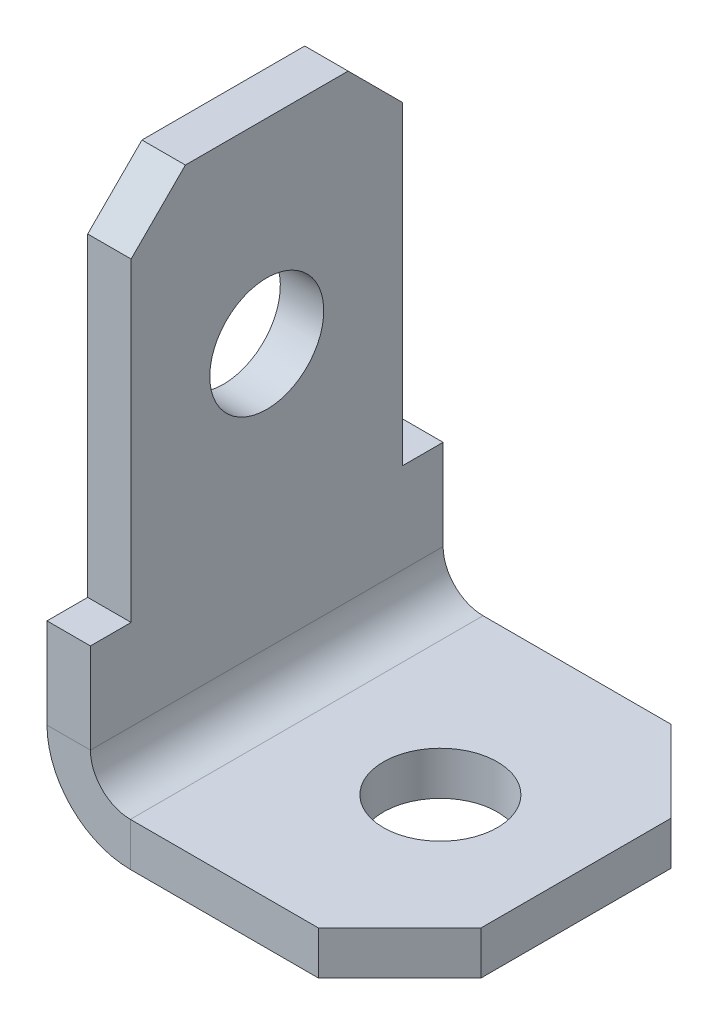
ISO-10303-21;
HEADER;
FILE_DESCRIPTION(('STEP AP214'),'2;1');
FILE_NAME('part.step','',(''),(''),'','','');
FILE_SCHEMA(('AUTOMOTIVE_DESIGN { 1 0 10303 214 1 1 1 1 }'));
ENDSEC;
DATA;
#1=APPLICATION_CONTEXT('core data for automotive mechanical design processes');
#2=APPLICATION_PROTOCOL_DEFINITION('international standard','automotive_design',2000,#1);
#3=PRODUCT_CONTEXT('',#1,'mechanical');
#4=PRODUCT('Part','Part','',(#3));
#5=PRODUCT_RELATED_PRODUCT_CATEGORY('part','',(#4));
#6=PRODUCT_DEFINITION_FORMATION('','',#4);
#7=PRODUCT_DEFINITION_CONTEXT('part definition',#1,'design');
#8=PRODUCT_DEFINITION('design','',#6,#7);
#9=PRODUCT_DEFINITION_SHAPE('','',#8);
#10=(LENGTH_UNIT() NAMED_UNIT(*) SI_UNIT(.MILLI.,.METRE.));
#11=(NAMED_UNIT(*) PLANE_ANGLE_UNIT() SI_UNIT($,.RADIAN.));
#12=(NAMED_UNIT(*) SI_UNIT($,.STERADIAN.) SOLID_ANGLE_UNIT());
#13=UNCERTAINTY_MEASURE_WITH_UNIT(LENGTH_MEASURE(1.E-05),#10,'distance_accuracy_value','');
#14=(GEOMETRIC_REPRESENTATION_CONTEXT(3) GLOBAL_UNCERTAINTY_ASSIGNED_CONTEXT((#13)) GLOBAL_UNIT_ASSIGNED_CONTEXT((#10,
#11,#12)) REPRESENTATION_CONTEXT('',''));
#15=CARTESIAN_POINT('',(0.,0.,0.));
#16=DIRECTION('',(0.,0.,1.));
#17=DIRECTION('',(1.,0.,0.));
#18=AXIS2_PLACEMENT_3D('',#15,#16,#17);
#19=CARTESIAN_POINT('',(-3.25000000000003,9.2,3.25));
#20=DIRECTION('',(0.,0.,-1.));
#21=DIRECTION('',(-1.,0.,0.));
#22=AXIS2_PLACEMENT_3D('',#19,#20,#21);
#23=PLANE('',#22);
#24=DIRECTION('',(-1.,0.,0.));
#25=VECTOR('',#24,1.);
#26=CARTESIAN_POINT('',(3.25000000000002,2.40000000000002,3.25));
#27=LINE('',#26,#25);
#28=CARTESIAN_POINT('',(-2.45000000000001,2.4,3.25));
#29=VERTEX_POINT('',#28);
#30=CARTESIAN_POINT('',(-3.25000000000001,2.4,3.25));
#31=VERTEX_POINT('',#30);
#32=EDGE_CURVE('E330',#29,#31,#27,.T.);
#33=ORIENTED_EDGE('',*,*,#32,.T.);
#34=DIRECTION('',(0.,1.,0.));
#35=VECTOR('',#34,1.);
#36=CARTESIAN_POINT('',(-3.25,0.,3.25));
#37=LINE('',#36,#35);
#38=CARTESIAN_POINT('',(-3.25,0.736599999999995,3.25));
#39=VERTEX_POINT('',#38);
#40=EDGE_CURVE('E202',#39,#31,#37,.T.);
#41=ORIENTED_EDGE('',*,*,#40,.F.);
#42=DIRECTION('',(1.,0.,0.));
#43=VECTOR('',#42,1.);
#44=CARTESIAN_POINT('',(-2.45,0.736599999999997,3.25));
#45=LINE('',#44,#43);
#46=CARTESIAN_POINT('',(-2.45,0.736599999999997,3.25));
#47=VERTEX_POINT('',#46);
#48=EDGE_CURVE('E219',#47,#39,#45,.F.);
#49=ORIENTED_EDGE('',*,*,#48,.F.);
#50=DIRECTION('',(0.,-1.,0.));
#51=VECTOR('',#50,1.);
#52=CARTESIAN_POINT('',(-2.45000000000003,9.2,3.25));
#53=LINE('',#52,#51);
#54=EDGE_CURVE('E214',#47,#29,#53,.F.);
#55=ORIENTED_EDGE('',*,*,#54,.T.);
#56=EDGE_LOOP('',(#33,#41,#49,#55));
#57=FACE_BOUND('',#56,.T.);
#58=ADVANCED_FACE('F58',(#57),#23,.F.);
#59=CARTESIAN_POINT('',(-3.25,0.,0.));
#60=DIRECTION('',(1.,0.,0.));
#61=DIRECTION('',(0.,1.,0.));
#62=AXIS2_PLACEMENT_3D('',#59,#60,#61);
#63=PLANE('',#62);
#64=CARTESIAN_POINT('',(-3.25000000000002,5.6,0.));
#65=DIRECTION('',(-1.,0.,0.));
#66=DIRECTION('',(0.,-1.,0.));
#67=AXIS2_PLACEMENT_3D('',#64,#65,#66);
#68=CIRCLE('',#67,1.05);
#69=CARTESIAN_POINT('',(-3.25000000000002,4.55,0.));
#70=VERTEX_POINT('',#69);
#71=EDGE_CURVE('E333',#70,#70,#68,.T.);
#72=ORIENTED_EDGE('',*,*,#71,.F.);
#73=EDGE_LOOP('',(#72));
#74=FACE_BOUND('',#73,.T.);
#75=DIRECTION('',(0.,-1.,0.));
#76=VECTOR('',#75,1.);
#77=CARTESIAN_POINT('',(-3.25,0.,2.5));
#78=LINE('',#77,#76);
#79=CARTESIAN_POINT('',(-3.25000000000003,8.19999999999999,2.5));
#80=VERTEX_POINT('',#79);
#81=CARTESIAN_POINT('',(-3.25000000000001,2.4,2.5));
#82=VERTEX_POINT('',#81);
#83=EDGE_CURVE('E317',#80,#82,#78,.T.);
#84=ORIENTED_EDGE('',*,*,#83,.F.);
#85=DIRECTION('',(0.,-0.707106781186548,0.707106781186547));
#86=VECTOR('',#85,1.);
#87=CARTESIAN_POINT('',(-3.25000000000003,9.2,1.49999999999999));
#88=LINE('',#87,#86);
#89=CARTESIAN_POINT('',(-3.25000000000003,9.2,1.49999999999999));
#90=VERTEX_POINT('',#89);
#91=EDGE_CURVE('E13',#80,#90,#88,.F.);
#92=ORIENTED_EDGE('',*,*,#91,.T.);
#93=DIRECTION('',(0.,0.,-1.));
#94=VECTOR('',#93,1.);
#95=CARTESIAN_POINT('',(-3.25000000000003,9.2,0.));
#96=LINE('',#95,#94);
#97=CARTESIAN_POINT('',(-3.25000000000003,9.2,-1.49999999999999));
#98=VERTEX_POINT('',#97);
#99=EDGE_CURVE('E197',#90,#98,#96,.T.);
#100=ORIENTED_EDGE('',*,*,#99,.T.);
#101=DIRECTION('',(0.,-0.707106781186548,-0.707106781186547));
#102=VECTOR('',#101,1.);
#103=CARTESIAN_POINT('',(-3.25000000000003,8.19999999999999,-2.5));
#104=LINE('',#103,#102);
#105=CARTESIAN_POINT('',(-3.25000000000003,8.19999999999999,-2.5));
#106=VERTEX_POINT('',#105);
#107=EDGE_CURVE('E297',#98,#106,#104,.T.);
#108=ORIENTED_EDGE('',*,*,#107,.T.);
#109=DIRECTION('',(0.,-1.,0.));
#110=VECTOR('',#109,1.);
#111=CARTESIAN_POINT('',(-3.25,0.,-2.5));
#112=LINE('',#111,#110);
#113=CARTESIAN_POINT('',(-3.25000000000001,2.4,-2.5));
#114=VERTEX_POINT('',#113);
#115=EDGE_CURVE('E189',#106,#114,#112,.T.);
#116=ORIENTED_EDGE('',*,*,#115,.T.);
#117=DIRECTION('',(0.,0.,1.));
#118=VECTOR('',#117,1.);
#119=CARTESIAN_POINT('',(-3.25000000000001,2.4,0.));
#120=LINE('',#119,#118);
#121=CARTESIAN_POINT('',(-3.25000000000001,2.4,-3.25));
#122=VERTEX_POINT('',#121);
#123=EDGE_CURVE('E175',#122,#114,#120,.T.);
#124=ORIENTED_EDGE('',*,*,#123,.F.);
#125=DIRECTION('',(0.,-1.,0.));
#126=VECTOR('',#125,1.);
#127=CARTESIAN_POINT('',(-3.25,0.,-3.25));
#128=LINE('',#127,#126);
#129=CARTESIAN_POINT('',(-3.25,0.736599999999995,-3.25));
#130=VERTEX_POINT('',#129);
#131=EDGE_CURVE('E186',#122,#130,#128,.T.);
#132=ORIENTED_EDGE('',*,*,#131,.T.);
#133=DIRECTION('',(0.,0.,1.));
#134=VECTOR('',#133,1.);
#135=CARTESIAN_POINT('',(-3.25,0.736599999999995,-3.25));
#136=LINE('',#135,#134);
#137=EDGE_CURVE('E217',#39,#130,#136,.F.);
#138=ORIENTED_EDGE('',*,*,#137,.F.);
#139=ORIENTED_EDGE('',*,*,#40,.T.);
#140=DIRECTION('',(0.,0.,-1.));
#141=VECTOR('',#140,1.);
#142=CARTESIAN_POINT('',(-3.25000000000001,2.4,0.));
#143=LINE('',#142,#141);
#144=EDGE_CURVE('E319',#31,#82,#143,.T.);
#145=ORIENTED_EDGE('',*,*,#144,.T.);
#146=EDGE_LOOP('',(#84,#92,#100,#108,#116,#124,#132,#138,#139,#145));
#147=FACE_BOUND('',#146,.T.);
#148=ADVANCED_FACE('F184',(#74,#147),#63,.F.);
#149=CARTESIAN_POINT('',(-2.45,0.,0.));
#150=DIRECTION('',(1.,0.,0.));
#151=DIRECTION('',(0.,1.,0.));
#152=AXIS2_PLACEMENT_3D('',#149,#150,#151);
#153=PLANE('',#152);
#154=CARTESIAN_POINT('',(-2.45000000000002,5.6,0.));
#155=DIRECTION('',(1.,0.,0.));
#156=DIRECTION('',(0.,1.,0.));
#157=AXIS2_PLACEMENT_3D('',#154,#155,#156);
#158=CIRCLE('',#157,1.05);
#159=CARTESIAN_POINT('',(-2.45000000000002,4.55,0.));
#160=VERTEX_POINT('',#159);
#161=EDGE_CURVE('E225',#160,#160,#158,.T.);
#162=ORIENTED_EDGE('',*,*,#161,.F.);
#163=EDGE_LOOP('',(#162));
#164=FACE_BOUND('',#163,.T.);
#165=DIRECTION('',(0.,0.,1.));
#166=VECTOR('',#165,1.);
#167=CARTESIAN_POINT('',(-2.45000000000003,9.2,-3.25));
#168=LINE('',#167,#166);
#169=CARTESIAN_POINT('',(-2.45000000000003,9.2,1.49999999999999));
#170=VERTEX_POINT('',#169);
#171=CARTESIAN_POINT('',(-2.45000000000003,9.2,-1.49999999999999));
#172=VERTEX_POINT('',#171);
#173=EDGE_CURVE('E212',#170,#172,#168,.F.);
#174=ORIENTED_EDGE('',*,*,#173,.F.);
#175=DIRECTION('',(0.,0.707106781186548,-0.707106781186547));
#176=VECTOR('',#175,1.);
#177=CARTESIAN_POINT('',(-2.45000000000002,5.34999999999998,5.35000000000001));
#178=LINE('',#177,#176);
#179=CARTESIAN_POINT('',(-2.45000000000003,8.2,2.5));
#180=VERTEX_POINT('',#179);
#181=EDGE_CURVE('E81',#170,#180,#178,.F.);
#182=ORIENTED_EDGE('',*,*,#181,.T.);
#183=DIRECTION('',(0.,1.,0.));
#184=VECTOR('',#183,1.);
#185=CARTESIAN_POINT('',(-2.45,0.,2.5));
#186=LINE('',#185,#184);
#187=CARTESIAN_POINT('',(-2.45000000000002,2.4,2.5));
#188=VERTEX_POINT('',#187);
#189=EDGE_CURVE('E325',#188,#180,#186,.T.);
#190=ORIENTED_EDGE('',*,*,#189,.F.);
#191=DIRECTION('',(0.,0.,1.));
#192=VECTOR('',#191,1.);
#193=CARTESIAN_POINT('',(-2.45000000000001,2.4,0.));
#194=LINE('',#193,#192);
#195=EDGE_CURVE('E276',#188,#29,#194,.T.);
#196=ORIENTED_EDGE('',*,*,#195,.T.);
#197=ORIENTED_EDGE('',*,*,#54,.F.);
#198=DIRECTION('',(0.,0.,1.));
#199=VECTOR('',#198,1.);
#200=CARTESIAN_POINT('',(-2.45,0.736599999999997,-3.25));
#201=LINE('',#200,#199);
#202=CARTESIAN_POINT('',(-2.45,0.736599999999997,-3.25));
#203=VERTEX_POINT('',#202);
#204=EDGE_CURVE('E222',#203,#47,#201,.T.);
#205=ORIENTED_EDGE('',*,*,#204,.F.);
#206=DIRECTION('',(0.,1.,0.));
#207=VECTOR('',#206,1.);
#208=CARTESIAN_POINT('',(-2.45,0.,-3.25));
#209=LINE('',#208,#207);
#210=CARTESIAN_POINT('',(-2.45000000000002,2.4,-3.25));
#211=VERTEX_POINT('',#210);
#212=EDGE_CURVE('E210',#211,#203,#209,.F.);
#213=ORIENTED_EDGE('',*,*,#212,.F.);
#214=DIRECTION('',(0.,0.,-1.));
#215=VECTOR('',#214,1.);
#216=CARTESIAN_POINT('',(-2.45000000000001,2.4,0.));
#217=LINE('',#216,#215);
#218=CARTESIAN_POINT('',(-2.45000000000001,2.4,-2.5));
#219=VERTEX_POINT('',#218);
#220=EDGE_CURVE('E177',#219,#211,#217,.T.);
#221=ORIENTED_EDGE('',*,*,#220,.F.);
#222=DIRECTION('',(0.,1.,0.));
#223=VECTOR('',#222,1.);
#224=CARTESIAN_POINT('',(-2.45,0.,-2.5));
#225=LINE('',#224,#223);
#226=CARTESIAN_POINT('',(-2.45000000000003,8.2,-2.5));
#227=VERTEX_POINT('',#226);
#228=EDGE_CURVE('E205',#219,#227,#225,.T.);
#229=ORIENTED_EDGE('',*,*,#228,.T.);
#230=DIRECTION('',(0.,0.707106781186548,0.707106781186547));
#231=VECTOR('',#230,1.);
#232=CARTESIAN_POINT('',(-2.45000000000002,5.34999999999998,-5.35000000000001));
#233=LINE('',#232,#231);
#234=EDGE_CURVE('E291',#227,#172,#233,.T.);
#235=ORIENTED_EDGE('',*,*,#234,.T.);
#236=EDGE_LOOP('',(#174,#182,#190,#196,#197,#205,#213,#221,#229,#235));
#237=FACE_BOUND('',#236,.T.);
#238=ADVANCED_FACE('F308',(#164,#237),#153,.T.);
#239=CARTESIAN_POINT('',(-3.25000000000003,9.2,-3.25));
#240=DIRECTION('',(0.,-1.,0.));
#241=DIRECTION('',(1.,0.,0.));
#242=AXIS2_PLACEMENT_3D('',#239,#240,#241);
#243=PLANE('',#242);
#244=ORIENTED_EDGE('',*,*,#99,.F.);
#245=DIRECTION('',(1.,0.,0.));
#246=VECTOR('',#245,1.);
#247=CARTESIAN_POINT('',(-3.25000000000003,9.2,1.49999999999999));
#248=LINE('',#247,#246);
#249=EDGE_CURVE('E299',#90,#170,#248,.T.);
#250=ORIENTED_EDGE('',*,*,#249,.T.);
#251=ORIENTED_EDGE('',*,*,#173,.T.);
#252=DIRECTION('',(-1.,0.,0.));
#253=VECTOR('',#252,1.);
#254=CARTESIAN_POINT('',(-3.25000000000003,9.2,-1.49999999999999));
#255=LINE('',#254,#253);
#256=EDGE_CURVE('E294',#172,#98,#255,.T.);
#257=ORIENTED_EDGE('',*,*,#256,.T.);
#258=EDGE_LOOP('',(#244,#250,#251,#257));
#259=FACE_BOUND('',#258,.T.);
#260=ADVANCED_FACE('F305',(#259),#243,.F.);
#261=CARTESIAN_POINT('',(-3.25,-0.8,3.25));
#262=DIRECTION('',(0.,0.,1.));
#263=DIRECTION('',(1.,0.,0.));
#264=AXIS2_PLACEMENT_3D('',#261,#262,#263);
#265=PLANE('',#264);
#266=DIRECTION('',(1.,0.,0.));
#267=VECTOR('',#266,1.);
#268=CARTESIAN_POINT('',(-3.25,0.,3.25));
#269=LINE('',#268,#267);
#270=CARTESIAN_POINT('',(-1.7134,0.,3.25));
#271=VERTEX_POINT('',#270);
#272=CARTESIAN_POINT('',(1.75,0.,3.25));
#273=VERTEX_POINT('',#272);
#274=EDGE_CURVE('E243',#271,#273,#269,.T.);
#275=ORIENTED_EDGE('',*,*,#274,.F.);
#276=DIRECTION('',(0.,-1.,0.));
#277=VECTOR('',#276,1.);
#278=CARTESIAN_POINT('',(-1.7134,0.,3.25));
#279=LINE('',#278,#277);
#280=CARTESIAN_POINT('',(-1.7134,-0.8,3.25));
#281=VERTEX_POINT('',#280);
#282=EDGE_CURVE('E233',#271,#281,#279,.T.);
#283=ORIENTED_EDGE('',*,*,#282,.T.);
#284=DIRECTION('',(1.,0.,0.));
#285=VECTOR('',#284,1.);
#286=CARTESIAN_POINT('',(-3.25,-0.8,3.25));
#287=LINE('',#286,#285);
#288=CARTESIAN_POINT('',(1.75,-0.8,3.25));
#289=VERTEX_POINT('',#288);
#290=EDGE_CURVE('E246',#281,#289,#287,.T.);
#291=ORIENTED_EDGE('',*,*,#290,.T.);
#292=DIRECTION('',(0.,1.,0.));
#293=VECTOR('',#292,1.);
#294=CARTESIAN_POINT('',(1.75,-0.8,3.25));
#295=LINE('',#294,#293);
#296=EDGE_CURVE('E261',#289,#273,#295,.T.);
#297=ORIENTED_EDGE('',*,*,#296,.T.);
#298=EDGE_LOOP('',(#275,#283,#291,#297));
#299=FACE_BOUND('',#298,.T.);
#300=ADVANCED_FACE('F378',(#299),#265,.T.);
#301=CARTESIAN_POINT('',(0.,-0.8,0.));
#302=DIRECTION('',(0.,-1.,0.));
#303=DIRECTION('',(0.,0.,-1.));
#304=AXIS2_PLACEMENT_3D('',#301,#302,#303);
#305=PLANE('',#304);
#306=CARTESIAN_POINT('',(0.749999999999999,-0.8,0.));
#307=DIRECTION('',(0.,1.,0.));
#308=DIRECTION('',(0.,0.,1.));
#309=AXIS2_PLACEMENT_3D('',#306,#307,#308);
#310=CIRCLE('',#309,1.05);
#311=CARTESIAN_POINT('',(0.749999999999999,-0.8,1.05));
#312=VERTEX_POINT('',#311);
#313=EDGE_CURVE('E337',#312,#312,#310,.T.);
#314=ORIENTED_EDGE('',*,*,#313,.T.);
#315=EDGE_LOOP('',(#314));
#316=FACE_BOUND('',#315,.T.);
#317=ORIENTED_EDGE('',*,*,#290,.F.);
#318=DIRECTION('',(0.,0.,1.));
#319=VECTOR('',#318,1.);
#320=CARTESIAN_POINT('',(-1.7134,-0.8,3.25));
#321=LINE('',#320,#319);
#322=CARTESIAN_POINT('',(-1.7134,-0.8,-3.25));
#323=VERTEX_POINT('',#322);
#324=EDGE_CURVE('E226',#281,#323,#321,.F.);
#325=ORIENTED_EDGE('',*,*,#324,.T.);
#326=DIRECTION('',(-1.,0.,0.));
#327=VECTOR('',#326,1.);
#328=CARTESIAN_POINT('',(-3.25,-0.8,-3.25));
#329=LINE('',#328,#327);
#330=CARTESIAN_POINT('',(1.75,-0.8,-3.25));
#331=VERTEX_POINT('',#330);
#332=EDGE_CURVE('E258',#331,#323,#329,.T.);
#333=ORIENTED_EDGE('',*,*,#332,.F.);
#334=DIRECTION('',(-0.707106781186547,0.,-0.707106781186547));
#335=VECTOR('',#334,1.);
#336=CARTESIAN_POINT('',(1.75,-0.8,-3.25));
#337=LINE('',#336,#335);
#338=CARTESIAN_POINT('',(3.25,-0.8,-1.75));
#339=VERTEX_POINT('',#338);
#340=EDGE_CURVE('E255',#339,#331,#337,.T.);
#341=ORIENTED_EDGE('',*,*,#340,.F.);
#342=DIRECTION('',(0.,0.,-1.));
#343=VECTOR('',#342,1.);
#344=CARTESIAN_POINT('',(3.25,-0.8,1.75));
#345=LINE('',#344,#343);
#346=CARTESIAN_POINT('',(3.25,-0.8,1.75));
#347=VERTEX_POINT('',#346);
#348=EDGE_CURVE('E252',#347,#339,#345,.T.);
#349=ORIENTED_EDGE('',*,*,#348,.F.);
#350=DIRECTION('',(0.707106781186547,0.,-0.707106781186548));
#351=VECTOR('',#350,1.);
#352=CARTESIAN_POINT('',(1.75,-0.8,3.25));
#353=LINE('',#352,#351);
#354=EDGE_CURVE('E248',#289,#347,#353,.T.);
#355=ORIENTED_EDGE('',*,*,#354,.F.);
#356=EDGE_LOOP('',(#317,#325,#333,#341,#349,#355));
#357=FACE_BOUND('',#356,.T.);
#358=ADVANCED_FACE('F361',(#316,#357),#305,.T.);
#359=CARTESIAN_POINT('',(0.,0.,0.));
#360=DIRECTION('',(0.,-1.,0.));
#361=DIRECTION('',(0.,0.,-1.));
#362=AXIS2_PLACEMENT_3D('',#359,#360,#361);
#363=PLANE('',#362);
#364=CARTESIAN_POINT('',(0.749999999999999,0.,0.));
#365=DIRECTION('',(0.,1.,0.));
#366=DIRECTION('',(0.,0.,1.));
#367=AXIS2_PLACEMENT_3D('',#364,#365,#366);
#368=CIRCLE('',#367,1.05);
#369=CARTESIAN_POINT('',(0.749999999999999,0.,1.05));
#370=VERTEX_POINT('',#369);
#371=EDGE_CURVE('E322',#370,#370,#368,.T.);
#372=ORIENTED_EDGE('',*,*,#371,.F.);
#373=EDGE_LOOP('',(#372));
#374=FACE_BOUND('',#373,.T.);
#375=DIRECTION('',(0.,0.,1.));
#376=VECTOR('',#375,1.);
#377=CARTESIAN_POINT('',(-1.7134,0.,3.25));
#378=LINE('',#377,#376);
#379=CARTESIAN_POINT('',(-1.7134,0.,-3.25));
#380=VERTEX_POINT('',#379);
#381=EDGE_CURVE('E200',#271,#380,#378,.F.);
#382=ORIENTED_EDGE('',*,*,#381,.F.);
#383=ORIENTED_EDGE('',*,*,#274,.T.);
#384=DIRECTION('',(0.707106781186547,0.,-0.707106781186548));
#385=VECTOR('',#384,1.);
#386=CARTESIAN_POINT('',(1.75,0.,3.25));
#387=LINE('',#386,#385);
#388=CARTESIAN_POINT('',(3.25,0.,1.75));
#389=VERTEX_POINT('',#388);
#390=EDGE_CURVE('E263',#273,#389,#387,.T.);
#391=ORIENTED_EDGE('',*,*,#390,.T.);
#392=DIRECTION('',(0.,0.,-1.));
#393=VECTOR('',#392,1.);
#394=CARTESIAN_POINT('',(3.25,0.,1.75));
#395=LINE('',#394,#393);
#396=CARTESIAN_POINT('',(3.25,0.,-1.75));
#397=VERTEX_POINT('',#396);
#398=EDGE_CURVE('E266',#389,#397,#395,.T.);
#399=ORIENTED_EDGE('',*,*,#398,.T.);
#400=DIRECTION('',(-0.707106781186547,0.,-0.707106781186547));
#401=VECTOR('',#400,1.);
#402=CARTESIAN_POINT('',(1.75,0.,-3.25));
#403=LINE('',#402,#401);
#404=CARTESIAN_POINT('',(1.75,0.,-3.25));
#405=VERTEX_POINT('',#404);
#406=EDGE_CURVE('E269',#397,#405,#403,.T.);
#407=ORIENTED_EDGE('',*,*,#406,.T.);
#408=DIRECTION('',(-1.,0.,0.));
#409=VECTOR('',#408,1.);
#410=CARTESIAN_POINT('',(-3.25,0.,-3.25));
#411=LINE('',#410,#409);
#412=EDGE_CURVE('E249',#405,#380,#411,.T.);
#413=ORIENTED_EDGE('',*,*,#412,.T.);
#414=EDGE_LOOP('',(#382,#383,#391,#399,#407,#413));
#415=FACE_BOUND('',#414,.T.);
#416=ADVANCED_FACE('F383',(#374,#415),#363,.F.);
#417=CARTESIAN_POINT('',(-3.25,-0.8,-3.25));
#418=DIRECTION('',(0.,0.,-1.));
#419=DIRECTION('',(-1.,0.,0.));
#420=AXIS2_PLACEMENT_3D('',#417,#418,#419);
#421=PLANE('',#420);
#422=DIRECTION('',(0.,-1.,0.));
#423=VECTOR('',#422,1.);
#424=CARTESIAN_POINT('',(-1.7134,0.,-3.25));
#425=LINE('',#424,#423);
#426=EDGE_CURVE('E240',#380,#323,#425,.T.);
#427=ORIENTED_EDGE('',*,*,#426,.F.);
#428=ORIENTED_EDGE('',*,*,#412,.F.);
#429=DIRECTION('',(0.,1.,0.));
#430=VECTOR('',#429,1.);
#431=CARTESIAN_POINT('',(1.75,-0.8,-3.25));
#432=LINE('',#431,#430);
#433=EDGE_CURVE('E274',#331,#405,#432,.T.);
#434=ORIENTED_EDGE('',*,*,#433,.F.);
#435=ORIENTED_EDGE('',*,*,#332,.T.);
#436=EDGE_LOOP('',(#427,#428,#434,#435));
#437=FACE_BOUND('',#436,.T.);
#438=ADVANCED_FACE('F364',(#437),#421,.T.);
#439=CARTESIAN_POINT('',(1.75,-0.8,-3.25));
#440=DIRECTION('',(0.707106781186548,0.,-0.707106781186548));
#441=DIRECTION('',(-0.707106781186548,0.,-0.707106781186548));
#442=AXIS2_PLACEMENT_3D('',#439,#440,#441);
#443=PLANE('',#442);
#444=ORIENTED_EDGE('',*,*,#406,.F.);
#445=DIRECTION('',(0.,1.,0.));
#446=VECTOR('',#445,1.);
#447=CARTESIAN_POINT('',(3.25,-0.8,-1.75));
#448=LINE('',#447,#446);
#449=EDGE_CURVE('E277',#339,#397,#448,.T.);
#450=ORIENTED_EDGE('',*,*,#449,.F.);
#451=ORIENTED_EDGE('',*,*,#340,.T.);
#452=ORIENTED_EDGE('',*,*,#433,.T.);
#453=EDGE_LOOP('',(#444,#450,#451,#452));
#454=FACE_BOUND('',#453,.T.);
#455=ADVANCED_FACE('F367',(#454),#443,.T.);
#456=CARTESIAN_POINT('',(3.25,-0.8,1.75));
#457=DIRECTION('',(1.,0.,0.));
#458=DIRECTION('',(0.,0.,-1.));
#459=AXIS2_PLACEMENT_3D('',#456,#457,#458);
#460=PLANE('',#459);
#461=ORIENTED_EDGE('',*,*,#398,.F.);
#462=DIRECTION('',(0.,1.,0.));
#463=VECTOR('',#462,1.);
#464=CARTESIAN_POINT('',(3.25,-0.8,1.75));
#465=LINE('',#464,#463);
#466=EDGE_CURVE('E279',#347,#389,#465,.T.);
#467=ORIENTED_EDGE('',*,*,#466,.F.);
#468=ORIENTED_EDGE('',*,*,#348,.T.);
#469=ORIENTED_EDGE('',*,*,#449,.T.);
#470=EDGE_LOOP('',(#461,#467,#468,#469));
#471=FACE_BOUND('',#470,.T.);
#472=ADVANCED_FACE('F371',(#471),#460,.T.);
#473=CARTESIAN_POINT('',(1.75,-0.8,3.25));
#474=DIRECTION('',(0.707106781186548,0.,0.707106781186548));
#475=DIRECTION('',(0.707106781186548,0.,-0.707106781186548));
#476=AXIS2_PLACEMENT_3D('',#473,#474,#475);
#477=PLANE('',#476);
#478=ORIENTED_EDGE('',*,*,#390,.F.);
#479=ORIENTED_EDGE('',*,*,#296,.F.);
#480=ORIENTED_EDGE('',*,*,#354,.T.);
#481=ORIENTED_EDGE('',*,*,#466,.T.);
#482=EDGE_LOOP('',(#478,#479,#480,#481));
#483=FACE_BOUND('',#482,.T.);
#484=ADVANCED_FACE('F374',(#483),#477,.T.);
#485=CARTESIAN_POINT('',(-1.7134,0.7366,-3.25));
#486=DIRECTION('',(0.,0.,-1.));
#487=DIRECTION('',(-1.,0.,0.));
#488=AXIS2_PLACEMENT_3D('',#485,#486,#487);
#489=PLANE('',#488);
#490=DIRECTION('',(1.,0.,0.));
#491=VECTOR('',#490,1.);
#492=CARTESIAN_POINT('',(-3.25,0.736599999999995,-3.25));
#493=LINE('',#492,#491);
#494=EDGE_CURVE('E195',#203,#130,#493,.F.);
#495=ORIENTED_EDGE('',*,*,#494,.F.);
#496=CARTESIAN_POINT('',(-1.7134,0.7366,-3.25));
#497=DIRECTION('',(0.,0.,1.));
#498=DIRECTION('',(1.,0.,0.));
#499=AXIS2_PLACEMENT_3D('',#496,#497,#498);
#500=CIRCLE('',#499,0.7366);
#501=EDGE_CURVE('E236',#380,#203,#500,.F.);
#502=ORIENTED_EDGE('',*,*,#501,.F.);
#503=ORIENTED_EDGE('',*,*,#426,.T.);
#504=CARTESIAN_POINT('',(-1.7134,0.7366,-3.25));
#505=DIRECTION('',(0.,0.,1.));
#506=DIRECTION('',(1.,0.,0.));
#507=AXIS2_PLACEMENT_3D('',#504,#505,#506);
#508=CIRCLE('',#507,1.5366);
#509=EDGE_CURVE('E229',#323,#130,#508,.F.);
#510=ORIENTED_EDGE('',*,*,#509,.T.);
#511=EDGE_LOOP('',(#495,#502,#503,#510));
#512=FACE_BOUND('',#511,.T.);
#513=ADVANCED_FACE('F353',(#512),#489,.T.);
#514=CARTESIAN_POINT('',(-1.7134,0.7366,3.25));
#515=DIRECTION('',(0.,0.,-1.));
#516=DIRECTION('',(-1.,0.,0.));
#517=AXIS2_PLACEMENT_3D('',#514,#515,#516);
#518=PLANE('',#517);
#519=CARTESIAN_POINT('',(-1.7134,0.7366,3.25));
#520=DIRECTION('',(0.,0.,1.));
#521=DIRECTION('',(1.,0.,0.));
#522=AXIS2_PLACEMENT_3D('',#519,#520,#521);
#523=CIRCLE('',#522,0.7366);
#524=EDGE_CURVE('E196',#47,#271,#523,.T.);
#525=ORIENTED_EDGE('',*,*,#524,.F.);
#526=ORIENTED_EDGE('',*,*,#48,.T.);
#527=CARTESIAN_POINT('',(-1.7134,0.7366,3.25));
#528=DIRECTION('',(0.,0.,1.));
#529=DIRECTION('',(1.,0.,0.));
#530=AXIS2_PLACEMENT_3D('',#527,#528,#529);
#531=CIRCLE('',#530,1.5366);
#532=EDGE_CURVE('E230',#39,#281,#531,.T.);
#533=ORIENTED_EDGE('',*,*,#532,.T.);
#534=ORIENTED_EDGE('',*,*,#282,.F.);
#535=EDGE_LOOP('',(#525,#526,#533,#534));
#536=FACE_BOUND('',#535,.T.);
#537=ADVANCED_FACE('F349',(#536),#518,.F.);
#538=CARTESIAN_POINT('',(-1.7134,0.7366,3.25));
#539=DIRECTION('',(0.,0.,1.));
#540=DIRECTION('',(-1.,0.,0.));
#541=AXIS2_PLACEMENT_3D('',#538,#539,#540);
#542=CYLINDRICAL_SURFACE('',#541,1.5366);
#543=ORIENTED_EDGE('',*,*,#324,.F.);
#544=ORIENTED_EDGE('',*,*,#532,.F.);
#545=ORIENTED_EDGE('',*,*,#137,.T.);
#546=ORIENTED_EDGE('',*,*,#509,.F.);
#547=EDGE_LOOP('',(#543,#544,#545,#546));
#548=FACE_BOUND('',#547,.T.);
#549=ADVANCED_FACE('F351',(#548),#542,.T.);
#550=CARTESIAN_POINT('',(-1.7134,0.7366,3.25));
#551=DIRECTION('',(0.,0.,1.));
#552=DIRECTION('',(-1.,0.,0.));
#553=AXIS2_PLACEMENT_3D('',#550,#551,#552);
#554=CYLINDRICAL_SURFACE('',#553,0.7366);
#555=ORIENTED_EDGE('',*,*,#381,.T.);
#556=ORIENTED_EDGE('',*,*,#501,.T.);
#557=ORIENTED_EDGE('',*,*,#204,.T.);
#558=ORIENTED_EDGE('',*,*,#524,.T.);
#559=EDGE_LOOP('',(#555,#556,#557,#558));
#560=FACE_BOUND('',#559,.T.);
#561=ADVANCED_FACE('F381',(#560),#554,.F.);
#562=CARTESIAN_POINT('',(-3.25,0.,-3.25));
#563=DIRECTION('',(0.,0.,1.));
#564=DIRECTION('',(1.,0.,0.));
#565=AXIS2_PLACEMENT_3D('',#562,#563,#564);
#566=PLANE('',#565);
#567=ORIENTED_EDGE('',*,*,#131,.F.);
#568=DIRECTION('',(-1.,0.,0.));
#569=VECTOR('',#568,1.);
#570=CARTESIAN_POINT('',(3.25000000000002,2.40000000000002,-3.25));
#571=LINE('',#570,#569);
#572=EDGE_CURVE('E171',#211,#122,#571,.T.);
#573=ORIENTED_EDGE('',*,*,#572,.F.);
#574=ORIENTED_EDGE('',*,*,#212,.T.);
#575=ORIENTED_EDGE('',*,*,#494,.T.);
#576=EDGE_LOOP('',(#567,#573,#574,#575));
#577=FACE_BOUND('',#576,.T.);
#578=ADVANCED_FACE('F193',(#577),#566,.F.);
#579=CARTESIAN_POINT('',(3.25000000000002,2.40000000000002,0.));
#580=DIRECTION('',(0.,1.,0.));
#581=DIRECTION('',(-1.,0.,0.));
#582=AXIS2_PLACEMENT_3D('',#579,#580,#581);
#583=PLANE('',#582);
#584=DIRECTION('',(-1.,0.,0.));
#585=VECTOR('',#584,1.);
#586=CARTESIAN_POINT('',(3.25000000000002,2.40000000000002,2.5));
#587=LINE('',#586,#585);
#588=EDGE_CURVE('E327',#188,#82,#587,.T.);
#589=ORIENTED_EDGE('',*,*,#588,.T.);
#590=ORIENTED_EDGE('',*,*,#144,.F.);
#591=ORIENTED_EDGE('',*,*,#32,.F.);
#592=ORIENTED_EDGE('',*,*,#195,.F.);
#593=EDGE_LOOP('',(#589,#590,#591,#592));
#594=FACE_BOUND('',#593,.T.);
#595=ADVANCED_FACE('F341',(#594),#583,.T.);
#596=CARTESIAN_POINT('',(3.25000000000003,0.,2.5));
#597=DIRECTION('',(0.,0.,-1.));
#598=DIRECTION('',(-1.,0.,0.));
#599=AXIS2_PLACEMENT_3D('',#596,#597,#598);
#600=PLANE('',#599);
#601=ORIENTED_EDGE('',*,*,#189,.T.);
#602=DIRECTION('',(-1.,0.,0.));
#603=VECTOR('',#602,1.);
#604=CARTESIAN_POINT('',(3.25,8.20000000000002,2.5));
#605=LINE('',#604,#603);
#606=EDGE_CURVE('E67',#180,#80,#605,.T.);
#607=ORIENTED_EDGE('',*,*,#606,.T.);
#608=ORIENTED_EDGE('',*,*,#83,.T.);
#609=ORIENTED_EDGE('',*,*,#588,.F.);
#610=EDGE_LOOP('',(#601,#607,#608,#609));
#611=FACE_BOUND('',#610,.T.);
#612=ADVANCED_FACE('F339',(#611),#600,.F.);
#613=CARTESIAN_POINT('',(3.25000000000003,0.,-2.5));
#614=DIRECTION('',(0.,0.,-1.));
#615=DIRECTION('',(-1.,0.,0.));
#616=AXIS2_PLACEMENT_3D('',#613,#614,#615);
#617=PLANE('',#616);
#618=ORIENTED_EDGE('',*,*,#115,.F.);
#619=DIRECTION('',(1.,0.,0.));
#620=VECTOR('',#619,1.);
#621=CARTESIAN_POINT('',(-2.45000000000003,8.2,-2.5));
#622=LINE('',#621,#620);
#623=EDGE_CURVE('E288',#106,#227,#622,.T.);
#624=ORIENTED_EDGE('',*,*,#623,.T.);
#625=ORIENTED_EDGE('',*,*,#228,.F.);
#626=DIRECTION('',(-1.,0.,0.));
#627=VECTOR('',#626,1.);
#628=CARTESIAN_POINT('',(3.25000000000002,2.40000000000002,-2.5));
#629=LINE('',#628,#627);
#630=EDGE_CURVE('E181',#219,#114,#629,.T.);
#631=ORIENTED_EDGE('',*,*,#630,.T.);
#632=EDGE_LOOP('',(#618,#624,#625,#631));
#633=FACE_BOUND('',#632,.T.);
#634=ADVANCED_FACE('F316',(#633),#617,.T.);
#635=CARTESIAN_POINT('',(3.25000000000002,2.40000000000002,0.));
#636=DIRECTION('',(0.,-1.,0.));
#637=DIRECTION('',(1.,0.,0.));
#638=AXIS2_PLACEMENT_3D('',#635,#636,#637);
#639=PLANE('',#638);
#640=ORIENTED_EDGE('',*,*,#220,.T.);
#641=ORIENTED_EDGE('',*,*,#572,.T.);
#642=ORIENTED_EDGE('',*,*,#123,.T.);
#643=ORIENTED_EDGE('',*,*,#630,.F.);
#644=EDGE_LOOP('',(#640,#641,#642,#643));
#645=FACE_BOUND('',#644,.T.);
#646=ADVANCED_FACE('F173',(#645),#639,.F.);
#647=CARTESIAN_POINT('',(3.25000000000001,5.60000000000002,0.));
#648=DIRECTION('',(-1.,0.,0.));
#649=DIRECTION('',(0.,-1.,0.));
#650=AXIS2_PLACEMENT_3D('',#647,#648,#649);
#651=CYLINDRICAL_SURFACE('',#650,1.05);
#652=CARTESIAN_POINT('',(-2.45000000000002,4.55,0.));
#653=CARTESIAN_POINT('',(-2.45833333333335,4.55,0.));
#654=CARTESIAN_POINT('',(-2.46666666666668,4.55,0.));
#655=CARTESIAN_POINT('',(-2.48333333333335,4.55,0.));
#656=CARTESIAN_POINT('',(-2.49166666666668,4.55,0.));
#657=CARTESIAN_POINT('',(-2.50833333333335,4.55,0.));
#658=CARTESIAN_POINT('',(-2.51666666666668,4.55,0.));
#659=CARTESIAN_POINT('',(-2.53333333333335,4.55,0.));
#660=CARTESIAN_POINT('',(-2.54166666666668,4.55,0.));
#661=CARTESIAN_POINT('',(-2.55833333333335,4.55,0.));
#662=CARTESIAN_POINT('',(-2.56666666666668,4.55,0.));
#663=CARTESIAN_POINT('',(-2.58333333333335,4.55,0.));
#664=CARTESIAN_POINT('',(-2.59166666666668,4.55,0.));
#665=CARTESIAN_POINT('',(-2.60833333333335,4.55,0.));
#666=CARTESIAN_POINT('',(-2.61666666666668,4.55,0.));
#667=CARTESIAN_POINT('',(-2.63333333333335,4.55,0.));
#668=CARTESIAN_POINT('',(-2.64166666666668,4.55,0.));
#669=CARTESIAN_POINT('',(-2.65833333333335,4.55,0.));
#670=CARTESIAN_POINT('',(-2.66666666666668,4.55,0.));
#671=CARTESIAN_POINT('',(-2.68333333333335,4.55,0.));
#672=CARTESIAN_POINT('',(-2.69166666666668,4.55,0.));
#673=CARTESIAN_POINT('',(-2.70833333333335,4.55,0.));
#674=CARTESIAN_POINT('',(-2.71666666666668,4.55,0.));
#675=CARTESIAN_POINT('',(-2.73333333333335,4.55,0.));
#676=CARTESIAN_POINT('',(-2.74166666666668,4.55,0.));
#677=CARTESIAN_POINT('',(-2.75833333333335,4.55,0.));
#678=CARTESIAN_POINT('',(-2.76666666666668,4.55,0.));
#679=CARTESIAN_POINT('',(-2.78333333333335,4.55,0.));
#680=CARTESIAN_POINT('',(-2.79166666666668,4.55,0.));
#681=CARTESIAN_POINT('',(-2.80833333333335,4.55,0.));
#682=CARTESIAN_POINT('',(-2.81666666666668,4.55,0.));
#683=CARTESIAN_POINT('',(-2.83333333333335,4.55,0.));
#684=CARTESIAN_POINT('',(-2.84166666666668,4.55,0.));
#685=CARTESIAN_POINT('',(-2.85833333333335,4.55,0.));
#686=CARTESIAN_POINT('',(-2.86666666666668,4.55,0.));
#687=CARTESIAN_POINT('',(-2.88333333333335,4.55,0.));
#688=CARTESIAN_POINT('',(-2.89166666666668,4.55,0.));
#689=CARTESIAN_POINT('',(-2.90833333333335,4.55,0.));
#690=CARTESIAN_POINT('',(-2.91666666666668,4.55,0.));
#691=CARTESIAN_POINT('',(-2.93333333333335,4.55,0.));
#692=CARTESIAN_POINT('',(-2.94166666666668,4.55,0.));
#693=CARTESIAN_POINT('',(-2.95833333333335,4.55,0.));
#694=CARTESIAN_POINT('',(-2.96666666666668,4.55,0.));
#695=CARTESIAN_POINT('',(-2.98333333333335,4.55,0.));
#696=CARTESIAN_POINT('',(-2.99166666666668,4.55,0.));
#697=CARTESIAN_POINT('',(-3.00833333333335,4.55,0.));
#698=CARTESIAN_POINT('',(-3.01666666666668,4.55,0.));
#699=CARTESIAN_POINT('',(-3.03333333333335,4.55,0.));
#700=CARTESIAN_POINT('',(-3.04166666666668,4.55,0.));
#701=CARTESIAN_POINT('',(-3.05833333333335,4.55,0.));
#702=CARTESIAN_POINT('',(-3.06666666666668,4.55,0.));
#703=CARTESIAN_POINT('',(-3.08333333333335,4.55,0.));
#704=CARTESIAN_POINT('',(-3.09166666666668,4.55,0.));
#705=CARTESIAN_POINT('',(-3.10833333333335,4.55,0.));
#706=CARTESIAN_POINT('',(-3.11666666666668,4.55,0.));
#707=CARTESIAN_POINT('',(-3.13333333333335,4.55,0.));
#708=CARTESIAN_POINT('',(-3.14166666666668,4.55,0.));
#709=CARTESIAN_POINT('',(-3.15833333333335,4.55,0.));
#710=CARTESIAN_POINT('',(-3.16666666666668,4.55,0.));
#711=CARTESIAN_POINT('',(-3.18333333333335,4.55,0.));
#712=CARTESIAN_POINT('',(-3.19166666666668,4.55,0.));
#713=CARTESIAN_POINT('',(-3.20833333333335,4.55,0.));
#714=CARTESIAN_POINT('',(-3.21666666666668,4.55,0.));
#715=CARTESIAN_POINT('',(-3.23333333333335,4.55,0.));
#716=CARTESIAN_POINT('',(-3.24166666666668,4.55,0.));
#717=CARTESIAN_POINT('',(-3.25000000000002,4.55,0.));
#718=B_SPLINE_CURVE_WITH_KNOTS('',3,(#652,#653,#654,#655,#656,#657,#658,#659,#660,#661,#662,
#663,#664,#665,#666,#667,#668,#669,#670,#671,#672,#673,#674,#675,#676,#677,#678,#679,#680,#681,
#682,#683,#684,#685,#686,#687,#688,#689,#690,#691,#692,#693,#694,#695,#696,#697,#698,#699,#700,
#701,#702,#703,#704,#705,#706,#707,#708,#709,#710,#711,#712,#713,#714,#715,#716,#717),
.UNSPECIFIED.,.F.,.F.,(4,2,2,2,2,2,2,2,2,2,2,2,2,2,2,2,2,2,2,2,2,2,2,2,2,2,2,2,2,2,2,2,4),(0.,
0.0249999999999998,0.0499999999999997,0.0750000000000004,0.1,0.125,0.15,0.175,0.200000000000001,
0.225,0.25,0.275,0.3,0.325,0.35,0.375,0.4,0.425,0.45,0.475000000000001,0.5,0.525,0.55,0.575,0.6,
0.625000000000001,0.65,0.675,0.7,0.725,0.750000000000001,0.775,0.8),.UNSPECIFIED.);
#719=EDGE_CURVE('BSEAM456',#160,#70,#718,.T.);
#720=ORIENTED_EDGE('',*,*,#161,.T.);
#721=ORIENTED_EDGE('',*,*,#71,.T.);
#722=ORIENTED_EDGE('',*,*,#719,.T.);
#723=ORIENTED_EDGE('',*,*,#719,.F.);
#724=EDGE_LOOP('',(#720,#722,#721,#723));
#725=FACE_BOUND('',#724,.T.);
#726=ADVANCED_FACE('F456',(#725),#651,.F.);
#727=CARTESIAN_POINT('',(3.25,8.20000000000002,-2.5));
#728=DIRECTION('',(0.,0.707106781186547,-0.707106781186548));
#729=DIRECTION('',(-1.,0.,0.));
#730=AXIS2_PLACEMENT_3D('',#727,#728,#729);
#731=PLANE('',#730);
#732=ORIENTED_EDGE('',*,*,#107,.F.);
#733=ORIENTED_EDGE('',*,*,#256,.F.);
#734=ORIENTED_EDGE('',*,*,#234,.F.);
#735=ORIENTED_EDGE('',*,*,#623,.F.);
#736=EDGE_LOOP('',(#732,#733,#734,#735));
#737=FACE_BOUND('',#736,.T.);
#738=ADVANCED_FACE('F314',(#737),#731,.T.);
#739=CARTESIAN_POINT('',(-3.25000000000003,9.2,1.49999999999999));
#740=DIRECTION('',(0.,-0.707106781186547,-0.707106781186548));
#741=DIRECTION('',(1.,0.,0.));
#742=AXIS2_PLACEMENT_3D('',#739,#740,#741);
#743=PLANE('',#742);
#744=ORIENTED_EDGE('',*,*,#91,.F.);
#745=ORIENTED_EDGE('',*,*,#606,.F.);
#746=ORIENTED_EDGE('',*,*,#181,.F.);
#747=ORIENTED_EDGE('',*,*,#249,.F.);
#748=EDGE_LOOP('',(#744,#745,#746,#747));
#749=FACE_BOUND('',#748,.T.);
#750=ADVANCED_FACE('F61',(#749),#743,.F.);
#751=CARTESIAN_POINT('',(0.749999999999999,-0.8,0.));
#752=DIRECTION('',(0.,1.,0.));
#753=DIRECTION('',(0.,0.,1.));
#754=AXIS2_PLACEMENT_3D('',#751,#752,#753);
#755=CYLINDRICAL_SURFACE('',#754,1.05);
#756=ORIENTED_EDGE('',*,*,#313,.F.);
#757=EDGE_LOOP('',(#756));
#758=FACE_BOUND('',#757,.T.);
#759=ORIENTED_EDGE('',*,*,#371,.T.);
#760=EDGE_LOOP('',(#759));
#761=FACE_BOUND('',#760,.T.);
#762=ADVANCED_FACE('F475',(#758,#761),#755,.F.);
#763=CLOSED_SHELL('',(#58,#148,#238,#260,#300,#358,#416,#438,#455,#472,#484,#513,#537,#549,#561,
#578,#595,#612,#634,#646,#726,#738,#750,#762));
#764=MANIFOLD_SOLID_BREP('B2',#763);
#765=ADVANCED_BREP_SHAPE_REPRESENTATION('',(#18,#764),#14);
#766=SHAPE_DEFINITION_REPRESENTATION(#9,#765);
ENDSEC;
END-ISO-10303-21;
